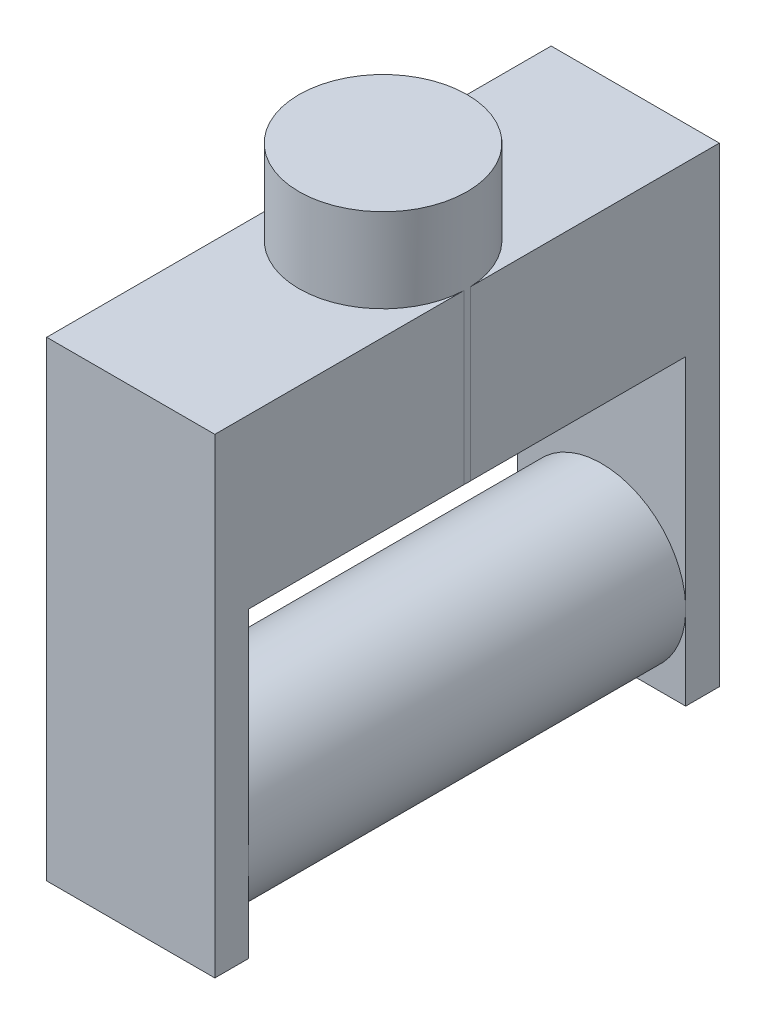
ISO-10303-21;
HEADER;
FILE_DESCRIPTION(('STEP AP214'),'2;1');
FILE_NAME('part.step','',(''),(''),'','','');
FILE_SCHEMA(('AUTOMOTIVE_DESIGN { 1 0 10303 214 1 1 1 1 }'));
ENDSEC;
DATA;
#1=APPLICATION_CONTEXT('core data for automotive mechanical design processes');
#2=APPLICATION_PROTOCOL_DEFINITION('international standard','automotive_design',2000,#1);
#3=PRODUCT_CONTEXT('',#1,'mechanical');
#4=PRODUCT('Part','Part','',(#3));
#5=PRODUCT_RELATED_PRODUCT_CATEGORY('part','',(#4));
#6=PRODUCT_DEFINITION_FORMATION('','',#4);
#7=PRODUCT_DEFINITION_CONTEXT('part definition',#1,'design');
#8=PRODUCT_DEFINITION('design','',#6,#7);
#9=PRODUCT_DEFINITION_SHAPE('','',#8);
#10=(LENGTH_UNIT() NAMED_UNIT(*) SI_UNIT(.MILLI.,.METRE.));
#11=(NAMED_UNIT(*) PLANE_ANGLE_UNIT() SI_UNIT($,.RADIAN.));
#12=(NAMED_UNIT(*) SI_UNIT($,.STERADIAN.) SOLID_ANGLE_UNIT());
#13=UNCERTAINTY_MEASURE_WITH_UNIT(LENGTH_MEASURE(1.E-05),#10,'distance_accuracy_value','');
#14=(GEOMETRIC_REPRESENTATION_CONTEXT(3) GLOBAL_UNCERTAINTY_ASSIGNED_CONTEXT((#13)) GLOBAL_UNIT_ASSIGNED_CONTEXT((#10,
#11,#12)) REPRESENTATION_CONTEXT('',''));
#15=CARTESIAN_POINT('',(0.,0.,0.));
#16=DIRECTION('',(0.,0.,1.));
#17=DIRECTION('',(1.,0.,0.));
#18=AXIS2_PLACEMENT_3D('',#15,#16,#17);
#19=CARTESIAN_POINT('',(-5.0037762754662,-33.,13.));
#20=DIRECTION('',(0.,0.,1.));
#21=DIRECTION('',(1.,0.,0.));
#22=AXIS2_PLACEMENT_3D('',#19,#20,#21);
#23=PLANE('',#22);
#24=CARTESIAN_POINT('',(0.,-28.,13.));
#25=DIRECTION('',(0.,0.,-1.));
#26=DIRECTION('',(-1.,0.,0.));
#27=AXIS2_PLACEMENT_3D('',#24,#25,#26);
#28=CIRCLE('',#27,5.);
#29=CARTESIAN_POINT('',(4.9962237245338,-28.1942897177042,13.));
#30=VERTEX_POINT('',#29);
#31=CARTESIAN_POINT('',(0.,-33.,13.));
#32=VERTEX_POINT('',#31);
#33=EDGE_CURVE('E53',#30,#32,#28,.T.);
#34=ORIENTED_EDGE('',*,*,#33,.F.);
#35=DIRECTION('',(0.,1.,0.));
#36=VECTOR('',#35,1.);
#37=CARTESIAN_POINT('',(4.9962237245338,-33.,13.));
#38=LINE('',#37,#36);
#39=CARTESIAN_POINT('',(4.9962237245338,-33.,13.));
#40=VERTEX_POINT('',#39);
#41=EDGE_CURVE('E199',#40,#30,#38,.T.);
#42=ORIENTED_EDGE('',*,*,#41,.F.);
#43=DIRECTION('',(1.,0.,0.));
#44=VECTOR('',#43,1.);
#45=CARTESIAN_POINT('',(-5.0037762754662,-33.,13.));
#46=LINE('',#45,#44);
#47=EDGE_CURVE('E468',#32,#40,#46,.T.);
#48=ORIENTED_EDGE('',*,*,#47,.F.);
#49=EDGE_LOOP('',(#34,#42,#48));
#50=FACE_BOUND('',#49,.T.);
#51=ADVANCED_FACE('F35',(#50),#23,.F.);
#52=CARTESIAN_POINT('',(-5.0037762754662,-33.,-13.));
#53=DIRECTION('',(0.,0.,1.));
#54=DIRECTION('',(1.,0.,0.));
#55=AXIS2_PLACEMENT_3D('',#52,#53,#54);
#56=PLANE('',#55);
#57=DIRECTION('',(0.,1.,0.));
#58=VECTOR('',#57,1.);
#59=CARTESIAN_POINT('',(4.9962237245338,-33.,-13.));
#60=LINE('',#59,#58);
#61=CARTESIAN_POINT('',(4.9962237245338,-33.,-13.));
#62=VERTEX_POINT('',#61);
#63=CARTESIAN_POINT('',(4.9962237245338,-28.1942897177042,-13.));
#64=VERTEX_POINT('',#63);
#65=EDGE_CURVE('E153',#62,#64,#60,.T.);
#66=ORIENTED_EDGE('',*,*,#65,.T.);
#67=CARTESIAN_POINT('',(0.,-28.,-13.));
#68=DIRECTION('',(0.,0.,1.));
#69=DIRECTION('',(1.,0.,0.));
#70=AXIS2_PLACEMENT_3D('',#67,#68,#69);
#71=CIRCLE('',#70,5.);
#72=CARTESIAN_POINT('',(0.,-33.,-13.));
#73=VERTEX_POINT('',#72);
#74=EDGE_CURVE('E139',#73,#64,#71,.T.);
#75=ORIENTED_EDGE('',*,*,#74,.F.);
#76=DIRECTION('',(1.,0.,0.));
#77=VECTOR('',#76,1.);
#78=CARTESIAN_POINT('',(-5.0037762754662,-33.,-13.));
#79=LINE('',#78,#77);
#80=EDGE_CURVE('E151',#73,#62,#79,.T.);
#81=ORIENTED_EDGE('',*,*,#80,.T.);
#82=EDGE_LOOP('',(#66,#75,#81));
#83=FACE_BOUND('',#82,.T.);
#84=ADVANCED_FACE('F150',(#83),#56,.T.);
#85=CARTESIAN_POINT('',(0.,-15.,0.));
#86=DIRECTION('',(0.,1.,0.));
#87=DIRECTION('',(0.,0.,1.));
#88=AXIS2_PLACEMENT_3D('',#85,#86,#87);
#89=PLANE('',#88);
#90=DIRECTION('',(0.,0.,-1.));
#91=VECTOR('',#90,1.);
#92=CARTESIAN_POINT('',(-5.00377627546619,-15.,15.));
#93=LINE('',#92,#91);
#94=CARTESIAN_POINT('',(-5.00377627546619,-15.,13.));
#95=VERTEX_POINT('',#94);
#96=CARTESIAN_POINT('',(-5.00377627546619,-15.,-13.));
#97=VERTEX_POINT('',#96);
#98=EDGE_CURVE('E269',#95,#97,#93,.T.);
#99=ORIENTED_EDGE('',*,*,#98,.T.);
#100=DIRECTION('',(1.,0.,0.));
#101=VECTOR('',#100,1.);
#102=CARTESIAN_POINT('',(-5.0037762754662,-15.,-13.));
#103=LINE('',#102,#101);
#104=CARTESIAN_POINT('',(4.99622372453381,-15.,-13.));
#105=VERTEX_POINT('',#104);
#106=EDGE_CURVE('E178',#97,#105,#103,.T.);
#107=ORIENTED_EDGE('',*,*,#106,.T.);
#108=DIRECTION('',(0.,0.,1.));
#109=VECTOR('',#108,1.);
#110=CARTESIAN_POINT('',(4.99622372453381,-15.,-15.));
#111=LINE('',#110,#109);
#112=CARTESIAN_POINT('',(4.99622372453381,-15.,-0.194289717704062));
#113=VERTEX_POINT('',#112);
#114=EDGE_CURVE('E450',#105,#113,#111,.T.);
#115=ORIENTED_EDGE('',*,*,#114,.T.);
#116=CARTESIAN_POINT('',(0.,-15.,0.));
#117=DIRECTION('',(0.,1.,0.));
#118=DIRECTION('',(0.,0.,1.));
#119=AXIS2_PLACEMENT_3D('',#116,#117,#118);
#120=CIRCLE('',#119,5.);
#121=CARTESIAN_POINT('',(4.99622372453381,-15.,0.194289717704063));
#122=VERTEX_POINT('',#121);
#123=EDGE_CURVE('E273',#122,#113,#120,.T.);
#124=ORIENTED_EDGE('',*,*,#123,.F.);
#125=DIRECTION('',(0.,0.,-1.));
#126=VECTOR('',#125,1.);
#127=CARTESIAN_POINT('',(4.99622372453381,-15.,15.));
#128=LINE('',#127,#126);
#129=CARTESIAN_POINT('',(4.9962237245338,-15.,13.));
#130=VERTEX_POINT('',#129);
#131=EDGE_CURVE('E456',#130,#122,#128,.T.);
#132=ORIENTED_EDGE('',*,*,#131,.F.);
#133=DIRECTION('',(1.,0.,0.));
#134=VECTOR('',#133,1.);
#135=CARTESIAN_POINT('',(-5.0037762754662,-15.,13.));
#136=LINE('',#135,#134);
#137=EDGE_CURVE('E458',#95,#130,#136,.T.);
#138=ORIENTED_EDGE('',*,*,#137,.F.);
#139=EDGE_LOOP('',(#99,#107,#115,#124,#132,#138));
#140=FACE_BOUND('',#139,.T.);
#141=ADVANCED_FACE('F213',(#140),#89,.F.);
#142=CARTESIAN_POINT('',(0.,-15.,0.));
#143=DIRECTION('',(0.,1.,0.));
#144=DIRECTION('',(0.,0.,1.));
#145=AXIS2_PLACEMENT_3D('',#142,#143,#144);
#146=CYLINDRICAL_SURFACE('',#145,5.);
#147=DIRECTION('',(0.,1.,0.));
#148=VECTOR('',#147,1.);
#149=CARTESIAN_POINT('',(4.99622372453381,-15.,-0.194289717704062));
#150=LINE('',#149,#148);
#151=CARTESIAN_POINT('',(4.99622372453381,-5.,-0.19428971770408));
#152=VERTEX_POINT('',#151);
#153=EDGE_CURVE('E11',#152,#113,#150,.F.);
#154=ORIENTED_EDGE('',*,*,#153,.F.);
#155=CARTESIAN_POINT('',(0.,-5.,0.));
#156=DIRECTION('',(0.,-1.,0.));
#157=DIRECTION('',(0.,0.,-1.));
#158=AXIS2_PLACEMENT_3D('',#155,#156,#157);
#159=CIRCLE('',#158,5.);
#160=CARTESIAN_POINT('',(4.99622372453381,-5.,0.19428971770408));
#161=VERTEX_POINT('',#160);
#162=EDGE_CURVE('E45',#152,#161,#159,.F.);
#163=ORIENTED_EDGE('',*,*,#162,.T.);
#164=DIRECTION('',(0.,1.,0.));
#165=VECTOR('',#164,1.);
#166=CARTESIAN_POINT('',(4.99622372453381,-15.,0.194289717704062));
#167=LINE('',#166,#165);
#168=EDGE_CURVE('E262',#161,#122,#167,.F.);
#169=ORIENTED_EDGE('',*,*,#168,.T.);
#170=ORIENTED_EDGE('',*,*,#123,.T.);
#171=EDGE_LOOP('',(#154,#163,#169,#170));
#172=FACE_BOUND('',#171,.T.);
#173=CARTESIAN_POINT('',(0.,0.,0.));
#174=DIRECTION('',(0.,1.,0.));
#175=DIRECTION('',(0.,0.,1.));
#176=AXIS2_PLACEMENT_3D('',#173,#174,#175);
#177=CIRCLE('',#176,5.);
#178=CARTESIAN_POINT('',(0.,0.,5.));
#179=VERTEX_POINT('',#178);
#180=EDGE_CURVE('E267',#179,#179,#177,.T.);
#181=ORIENTED_EDGE('',*,*,#180,.F.);
#182=EDGE_LOOP('',(#181));
#183=FACE_BOUND('',#182,.T.);
#184=ADVANCED_FACE('F37',(#172,#183),#146,.T.);
#185=CARTESIAN_POINT('',(0.,0.,0.));
#186=DIRECTION('',(0.,1.,0.));
#187=DIRECTION('',(0.,0.,1.));
#188=AXIS2_PLACEMENT_3D('',#185,#186,#187);
#189=PLANE('',#188);
#190=ORIENTED_EDGE('',*,*,#180,.T.);
#191=EDGE_LOOP('',(#190));
#192=FACE_BOUND('',#191,.T.);
#193=ADVANCED_FACE('F211',(#192),#189,.T.);
#194=CARTESIAN_POINT('',(4.99622372453381,-5.,15.));
#195=DIRECTION('',(-1.,0.,0.));
#196=DIRECTION('',(0.,-1.,0.));
#197=AXIS2_PLACEMENT_3D('',#194,#195,#196);
#198=PLANE('',#197);
#199=ORIENTED_EDGE('',*,*,#168,.F.);
#200=DIRECTION('',(0.,0.,-1.));
#201=VECTOR('',#200,1.);
#202=CARTESIAN_POINT('',(4.99622372453381,-5.,15.));
#203=LINE('',#202,#201);
#204=CARTESIAN_POINT('',(4.99622372453381,-5.,15.));
#205=VERTEX_POINT('',#204);
#206=EDGE_CURVE('E260',#205,#161,#203,.T.);
#207=ORIENTED_EDGE('',*,*,#206,.F.);
#208=DIRECTION('',(0.,1.,0.));
#209=VECTOR('',#208,1.);
#210=CARTESIAN_POINT('',(4.99622372453381,-5.,15.));
#211=LINE('',#210,#209);
#212=CARTESIAN_POINT('',(4.9962237245338,-33.,15.));
#213=VERTEX_POINT('',#212);
#214=EDGE_CURVE('E249',#213,#205,#211,.T.);
#215=ORIENTED_EDGE('',*,*,#214,.F.);
#216=DIRECTION('',(0.,0.,1.));
#217=VECTOR('',#216,1.);
#218=CARTESIAN_POINT('',(4.9962237245338,-33.,15.));
#219=LINE('',#218,#217);
#220=EDGE_CURVE('E460',#40,#213,#219,.T.);
#221=ORIENTED_EDGE('',*,*,#220,.F.);
#222=ORIENTED_EDGE('',*,*,#41,.T.);
#223=CARTESIAN_POINT('',(0.,-28.,13.));
#224=DIRECTION('',(0.,0.,-1.));
#225=DIRECTION('',(0.99924474490676,0.0388579435408494,0.));
#226=AXIS2_PLACEMENT_3D('',#223,#224,#225);
#227=CIRCLE('',#226,5.);
#228=CARTESIAN_POINT('',(4.9962237245338,-27.8057102822958,13.));
#229=VERTEX_POINT('',#228);
#230=EDGE_CURVE('E181',#229,#30,#227,.T.);
#231=ORIENTED_EDGE('',*,*,#230,.F.);
#232=EDGE_CURVE('E39',#229,#130,#38,.T.);
#233=ORIENTED_EDGE('',*,*,#232,.T.);
#234=ORIENTED_EDGE('',*,*,#131,.T.);
#235=EDGE_LOOP('',(#199,#207,#215,#221,#222,#231,#233,#234));
#236=FACE_BOUND('',#235,.T.);
#237=ADVANCED_FACE('F200',(#236),#198,.F.);
#238=CARTESIAN_POINT('',(-5.00377627546619,-5.,15.));
#239=DIRECTION('',(0.,-1.,0.));
#240=DIRECTION('',(0.,0.,-1.));
#241=AXIS2_PLACEMENT_3D('',#238,#239,#240);
#242=PLANE('',#241);
#243=ORIENTED_EDGE('',*,*,#162,.F.);
#244=DIRECTION('',(0.,0.,1.));
#245=VECTOR('',#244,1.);
#246=CARTESIAN_POINT('',(4.99622372453381,-5.,-15.));
#247=LINE('',#246,#245);
#248=CARTESIAN_POINT('',(4.99622372453381,-5.,-15.));
#249=VERTEX_POINT('',#248);
#250=EDGE_CURVE('E445',#249,#152,#247,.T.);
#251=ORIENTED_EDGE('',*,*,#250,.F.);
#252=DIRECTION('',(-1.,0.,0.));
#253=VECTOR('',#252,1.);
#254=CARTESIAN_POINT('',(-5.00377627546619,-5.,-15.));
#255=LINE('',#254,#253);
#256=CARTESIAN_POINT('',(-5.00377627546619,-5.,-15.));
#257=VERTEX_POINT('',#256);
#258=EDGE_CURVE('E451',#249,#257,#255,.T.);
#259=ORIENTED_EDGE('',*,*,#258,.T.);
#260=DIRECTION('',(0.,0.,-1.));
#261=VECTOR('',#260,1.);
#262=CARTESIAN_POINT('',(-5.00377627546619,-5.,15.));
#263=LINE('',#262,#261);
#264=CARTESIAN_POINT('',(-5.00377627546619,-5.,15.));
#265=VERTEX_POINT('',#264);
#266=EDGE_CURVE('E265',#265,#257,#263,.T.);
#267=ORIENTED_EDGE('',*,*,#266,.F.);
#268=DIRECTION('',(-1.,0.,0.));
#269=VECTOR('',#268,1.);
#270=CARTESIAN_POINT('',(-5.00377627546619,-5.,15.));
#271=LINE('',#270,#269);
#272=EDGE_CURVE('E251',#205,#265,#271,.T.);
#273=ORIENTED_EDGE('',*,*,#272,.F.);
#274=ORIENTED_EDGE('',*,*,#206,.T.);
#275=EDGE_LOOP('',(#243,#251,#259,#267,#273,#274));
#276=FACE_BOUND('',#275,.T.);
#277=ADVANCED_FACE('F210',(#276),#242,.F.);
#278=CARTESIAN_POINT('',(-5.00377627546619,-5.,15.));
#279=DIRECTION('',(1.,0.,0.));
#280=DIRECTION('',(0.,0.,-1.));
#281=AXIS2_PLACEMENT_3D('',#278,#279,#280);
#282=PLANE('',#281);
#283=ORIENTED_EDGE('',*,*,#266,.T.);
#284=DIRECTION('',(0.,-1.,0.));
#285=VECTOR('',#284,1.);
#286=CARTESIAN_POINT('',(-5.00377627546619,-5.,-15.));
#287=LINE('',#286,#285);
#288=CARTESIAN_POINT('',(-5.0037762754662,-33.,-15.));
#289=VERTEX_POINT('',#288);
#290=EDGE_CURVE('E482',#257,#289,#287,.T.);
#291=ORIENTED_EDGE('',*,*,#290,.T.);
#292=DIRECTION('',(0.,0.,1.));
#293=VECTOR('',#292,1.);
#294=CARTESIAN_POINT('',(-5.0037762754662,-33.,-15.));
#295=LINE('',#294,#293);
#296=CARTESIAN_POINT('',(-5.0037762754662,-33.,-13.));
#297=VERTEX_POINT('',#296);
#298=EDGE_CURVE('E170',#289,#297,#295,.T.);
#299=ORIENTED_EDGE('',*,*,#298,.T.);
#300=DIRECTION('',(0.,1.,0.));
#301=VECTOR('',#300,1.);
#302=CARTESIAN_POINT('',(-5.0037762754662,-33.,-13.));
#303=LINE('',#302,#301);
#304=EDGE_CURVE('E169',#297,#97,#303,.T.);
#305=ORIENTED_EDGE('',*,*,#304,.T.);
#306=ORIENTED_EDGE('',*,*,#98,.F.);
#307=DIRECTION('',(0.,1.,0.));
#308=VECTOR('',#307,1.);
#309=CARTESIAN_POINT('',(-5.0037762754662,-33.,13.));
#310=LINE('',#309,#308);
#311=CARTESIAN_POINT('',(-5.0037762754662,-33.,13.));
#312=VERTEX_POINT('',#311);
#313=EDGE_CURVE('E257',#312,#95,#310,.T.);
#314=ORIENTED_EDGE('',*,*,#313,.F.);
#315=DIRECTION('',(0.,0.,-1.));
#316=VECTOR('',#315,1.);
#317=CARTESIAN_POINT('',(-5.0037762754662,-33.,15.));
#318=LINE('',#317,#316);
#319=CARTESIAN_POINT('',(-5.0037762754662,-33.,15.));
#320=VERTEX_POINT('',#319);
#321=EDGE_CURVE('E466',#320,#312,#318,.T.);
#322=ORIENTED_EDGE('',*,*,#321,.F.);
#323=DIRECTION('',(0.,-1.,0.));
#324=VECTOR('',#323,1.);
#325=CARTESIAN_POINT('',(-5.00377627546619,-5.,15.));
#326=LINE('',#325,#324);
#327=EDGE_CURVE('E477',#265,#320,#326,.T.);
#328=ORIENTED_EDGE('',*,*,#327,.F.);
#329=EDGE_LOOP('',(#283,#291,#299,#305,#306,#314,#322,#328));
#330=FACE_BOUND('',#329,.T.);
#331=ADVANCED_FACE('F241',(#330),#282,.F.);
#332=CARTESIAN_POINT('',(0.,0.,15.));
#333=DIRECTION('',(0.,0.,1.));
#334=DIRECTION('',(1.,0.,0.));
#335=AXIS2_PLACEMENT_3D('',#332,#333,#334);
#336=PLANE('',#335);
#337=ORIENTED_EDGE('',*,*,#214,.T.);
#338=ORIENTED_EDGE('',*,*,#272,.T.);
#339=ORIENTED_EDGE('',*,*,#327,.T.);
#340=DIRECTION('',(-1.,0.,0.));
#341=VECTOR('',#340,1.);
#342=CARTESIAN_POINT('',(-5.0037762754662,-33.,15.));
#343=LINE('',#342,#341);
#344=EDGE_CURVE('E254',#213,#320,#343,.T.);
#345=ORIENTED_EDGE('',*,*,#344,.F.);
#346=EDGE_LOOP('',(#337,#338,#339,#345));
#347=FACE_BOUND('',#346,.T.);
#348=ADVANCED_FACE('F234',(#347),#336,.T.);
#349=EDGE_CURVE('E61',#32,#229,#28,.T.);
#350=ORIENTED_EDGE('',*,*,#349,.F.);
#351=EDGE_CURVE('E469',#312,#32,#46,.T.);
#352=ORIENTED_EDGE('',*,*,#351,.F.);
#353=ORIENTED_EDGE('',*,*,#313,.T.);
#354=ORIENTED_EDGE('',*,*,#137,.T.);
#355=ORIENTED_EDGE('',*,*,#232,.F.);
#356=EDGE_LOOP('',(#350,#352,#353,#354,#355));
#357=FACE_BOUND('',#356,.T.);
#358=ADVANCED_FACE('F225',(#357),#23,.F.);
#359=CARTESIAN_POINT('',(0.,-33.,0.));
#360=DIRECTION('',(0.,-1.,0.));
#361=DIRECTION('',(0.,0.,-1.));
#362=AXIS2_PLACEMENT_3D('',#359,#360,#361);
#363=PLANE('',#362);
#364=ORIENTED_EDGE('',*,*,#220,.T.);
#365=ORIENTED_EDGE('',*,*,#344,.T.);
#366=ORIENTED_EDGE('',*,*,#321,.T.);
#367=ORIENTED_EDGE('',*,*,#351,.T.);
#368=ORIENTED_EDGE('',*,*,#47,.T.);
#369=EDGE_LOOP('',(#364,#365,#366,#367,#368));
#370=FACE_BOUND('',#369,.T.);
#371=ADVANCED_FACE('F233',(#370),#363,.T.);
#372=CARTESIAN_POINT('',(4.99622372453381,-5.,-15.));
#373=DIRECTION('',(1.,0.,0.));
#374=DIRECTION('',(0.,1.,0.));
#375=AXIS2_PLACEMENT_3D('',#372,#373,#374);
#376=PLANE('',#375);
#377=ORIENTED_EDGE('',*,*,#250,.T.);
#378=ORIENTED_EDGE('',*,*,#153,.T.);
#379=ORIENTED_EDGE('',*,*,#114,.F.);
#380=CARTESIAN_POINT('',(4.9962237245338,-27.8057102822958,-13.));
#381=VERTEX_POINT('',#380);
#382=EDGE_CURVE('E183',#381,#105,#60,.T.);
#383=ORIENTED_EDGE('',*,*,#382,.F.);
#384=CARTESIAN_POINT('',(0.,-28.,-13.));
#385=DIRECTION('',(0.,0.,1.));
#386=DIRECTION('',(0.99924474490676,-0.0388579435408508,0.));
#387=AXIS2_PLACEMENT_3D('',#384,#385,#386);
#388=CIRCLE('',#387,5.);
#389=EDGE_CURVE('E141',#64,#381,#388,.T.);
#390=ORIENTED_EDGE('',*,*,#389,.F.);
#391=ORIENTED_EDGE('',*,*,#65,.F.);
#392=DIRECTION('',(0.,0.,-1.));
#393=VECTOR('',#392,1.);
#394=CARTESIAN_POINT('',(4.9962237245338,-33.,-15.));
#395=LINE('',#394,#393);
#396=CARTESIAN_POINT('',(4.9962237245338,-33.,-15.));
#397=VERTEX_POINT('',#396);
#398=EDGE_CURVE('E164',#62,#397,#395,.T.);
#399=ORIENTED_EDGE('',*,*,#398,.T.);
#400=DIRECTION('',(0.,1.,0.));
#401=VECTOR('',#400,1.);
#402=CARTESIAN_POINT('',(4.99622372453381,-5.,-15.));
#403=LINE('',#402,#401);
#404=EDGE_CURVE('E186',#397,#249,#403,.T.);
#405=ORIENTED_EDGE('',*,*,#404,.T.);
#406=EDGE_LOOP('',(#377,#378,#379,#383,#390,#391,#399,#405));
#407=FACE_BOUND('',#406,.T.);
#408=ADVANCED_FACE('F239',(#407),#376,.T.);
#409=CARTESIAN_POINT('',(0.,0.,-15.));
#410=DIRECTION('',(0.,0.,-1.));
#411=DIRECTION('',(1.,0.,0.));
#412=AXIS2_PLACEMENT_3D('',#409,#410,#411);
#413=PLANE('',#412);
#414=ORIENTED_EDGE('',*,*,#404,.F.);
#415=DIRECTION('',(-1.,0.,0.));
#416=VECTOR('',#415,1.);
#417=CARTESIAN_POINT('',(-5.0037762754662,-33.,-15.));
#418=LINE('',#417,#416);
#419=EDGE_CURVE('E171',#397,#289,#418,.T.);
#420=ORIENTED_EDGE('',*,*,#419,.T.);
#421=ORIENTED_EDGE('',*,*,#290,.F.);
#422=ORIENTED_EDGE('',*,*,#258,.F.);
#423=EDGE_LOOP('',(#414,#420,#421,#422));
#424=FACE_BOUND('',#423,.T.);
#425=ADVANCED_FACE('F290',(#424),#413,.T.);
#426=EDGE_CURVE('E160',#297,#73,#79,.T.);
#427=ORIENTED_EDGE('',*,*,#426,.T.);
#428=EDGE_CURVE('E135',#381,#73,#71,.T.);
#429=ORIENTED_EDGE('',*,*,#428,.F.);
#430=ORIENTED_EDGE('',*,*,#382,.T.);
#431=ORIENTED_EDGE('',*,*,#106,.F.);
#432=ORIENTED_EDGE('',*,*,#304,.F.);
#433=EDGE_LOOP('',(#427,#429,#430,#431,#432));
#434=FACE_BOUND('',#433,.T.);
#435=ADVANCED_FACE('F166',(#434),#56,.T.);
#436=CARTESIAN_POINT('',(0.,-33.,0.));
#437=DIRECTION('',(0.,-1.,0.));
#438=DIRECTION('',(0.,0.,1.));
#439=AXIS2_PLACEMENT_3D('',#436,#437,#438);
#440=PLANE('',#439);
#441=ORIENTED_EDGE('',*,*,#398,.F.);
#442=ORIENTED_EDGE('',*,*,#80,.F.);
#443=ORIENTED_EDGE('',*,*,#426,.F.);
#444=ORIENTED_EDGE('',*,*,#298,.F.);
#445=ORIENTED_EDGE('',*,*,#419,.F.);
#446=EDGE_LOOP('',(#441,#442,#443,#444,#445));
#447=FACE_BOUND('',#446,.T.);
#448=ADVANCED_FACE('F158',(#447),#440,.T.);
#449=CARTESIAN_POINT('',(0.,-28.,-27.142135623731));
#450=DIRECTION('',(0.,0.,1.));
#451=DIRECTION('',(1.,0.,0.));
#452=AXIS2_PLACEMENT_3D('',#449,#450,#451);
#453=CYLINDRICAL_SURFACE('',#452,5.);
#454=ORIENTED_EDGE('',*,*,#428,.T.);
#455=ORIENTED_EDGE('',*,*,#74,.T.);
#456=ORIENTED_EDGE('',*,*,#389,.T.);
#457=EDGE_LOOP('',(#454,#455,#456));
#458=FACE_BOUND('',#457,.T.);
#459=ORIENTED_EDGE('',*,*,#230,.T.);
#460=ORIENTED_EDGE('',*,*,#33,.T.);
#461=ORIENTED_EDGE('',*,*,#349,.T.);
#462=EDGE_LOOP('',(#459,#460,#461));
#463=FACE_BOUND('',#462,.T.);
#464=ADVANCED_FACE('F137',(#458,#463),#453,.T.);
#465=CLOSED_SHELL('',(#51,#84,#141,#184,#193,#237,#277,#331,#348,#358,#371,#408,#425,#435,#448,#464));
#466=MANIFOLD_SOLID_BREP('B2',#465);
#467=ADVANCED_BREP_SHAPE_REPRESENTATION('',(#18,#466),#14);
#468=SHAPE_DEFINITION_REPRESENTATION(#9,#467);
ENDSEC;
END-ISO-10303-21;
